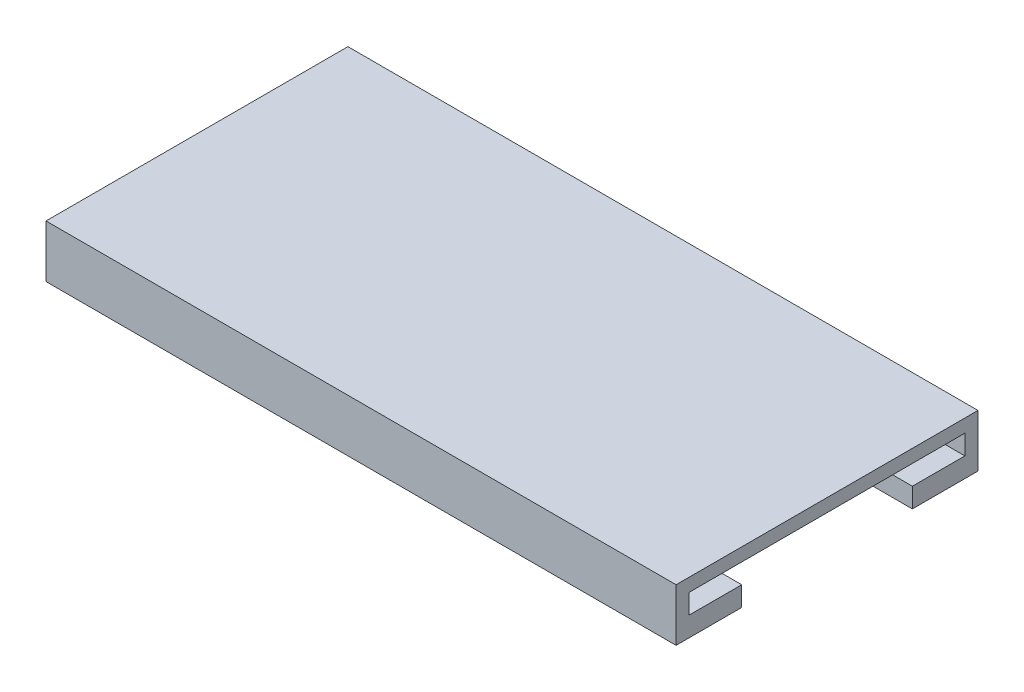
ISO-10303-21;
HEADER;
FILE_DESCRIPTION(('STEP AP214'),'2;1');
FILE_NAME('part.step','',(''),(''),'','','');
FILE_SCHEMA(('AUTOMOTIVE_DESIGN { 1 0 10303 214 1 1 1 1 }'));
ENDSEC;
DATA;
#1=APPLICATION_CONTEXT('core data for automotive mechanical design processes');
#2=APPLICATION_PROTOCOL_DEFINITION('international standard','automotive_design',2000,#1);
#3=PRODUCT_CONTEXT('',#1,'mechanical');
#4=PRODUCT('Part','Part','',(#3));
#5=PRODUCT_RELATED_PRODUCT_CATEGORY('part','',(#4));
#6=PRODUCT_DEFINITION_FORMATION('','',#4);
#7=PRODUCT_DEFINITION_CONTEXT('part definition',#1,'design');
#8=PRODUCT_DEFINITION('design','',#6,#7);
#9=PRODUCT_DEFINITION_SHAPE('','',#8);
#10=(LENGTH_UNIT() NAMED_UNIT(*) SI_UNIT(.MILLI.,.METRE.));
#11=(NAMED_UNIT(*) PLANE_ANGLE_UNIT() SI_UNIT($,.RADIAN.));
#12=(NAMED_UNIT(*) SI_UNIT($,.STERADIAN.) SOLID_ANGLE_UNIT());
#13=UNCERTAINTY_MEASURE_WITH_UNIT(LENGTH_MEASURE(1.E-05),#10,'distance_accuracy_value','');
#14=(GEOMETRIC_REPRESENTATION_CONTEXT(3) GLOBAL_UNCERTAINTY_ASSIGNED_CONTEXT((#13)) GLOBAL_UNIT_ASSIGNED_CONTEXT((#10,
#11,#12)) REPRESENTATION_CONTEXT('',''));
#15=CARTESIAN_POINT('',(0.,0.,0.));
#16=DIRECTION('',(0.,0.,1.));
#17=DIRECTION('',(1.,0.,0.));
#18=AXIS2_PLACEMENT_3D('',#15,#16,#17);
#19=CARTESIAN_POINT('',(76.2,-3.175,-18.25625));
#20=DIRECTION('',(0.,0.,1.));
#21=DIRECTION('',(1.,0.,0.));
#22=AXIS2_PLACEMENT_3D('',#19,#20,#21);
#23=PLANE('',#22);
#24=DIRECTION('',(0.,1.,0.));
#25=VECTOR('',#24,1.);
#26=CARTESIAN_POINT('',(0.,-3.175,-18.25625));
#27=LINE('',#26,#25);
#28=CARTESIAN_POINT('',(0.,-3.175,-18.25625));
#29=VERTEX_POINT('',#28);
#30=CARTESIAN_POINT('',(0.,3.175,-18.25625));
#31=VERTEX_POINT('',#30);
#32=EDGE_CURVE('E170',#29,#31,#27,.T.);
#33=ORIENTED_EDGE('',*,*,#32,.T.);
#34=DIRECTION('',(-1.,0.,0.));
#35=VECTOR('',#34,1.);
#36=CARTESIAN_POINT('',(76.2,3.175,-18.25625));
#37=LINE('',#36,#35);
#38=CARTESIAN_POINT('',(76.2,3.175,-18.25625));
#39=VERTEX_POINT('',#38);
#40=EDGE_CURVE('E11',#39,#31,#37,.T.);
#41=ORIENTED_EDGE('',*,*,#40,.F.);
#42=DIRECTION('',(0.,1.,0.));
#43=VECTOR('',#42,1.);
#44=CARTESIAN_POINT('',(76.2,-3.175,-18.25625));
#45=LINE('',#44,#43);
#46=CARTESIAN_POINT('',(76.2,-3.175,-18.25625));
#47=VERTEX_POINT('',#46);
#48=EDGE_CURVE('E204',#47,#39,#45,.T.);
#49=ORIENTED_EDGE('',*,*,#48,.F.);
#50=DIRECTION('',(-1.,0.,0.));
#51=VECTOR('',#50,1.);
#52=CARTESIAN_POINT('',(76.2,-3.175,-18.25625));
#53=LINE('',#52,#51);
#54=EDGE_CURVE('E166',#47,#29,#53,.T.);
#55=ORIENTED_EDGE('',*,*,#54,.T.);
#56=EDGE_LOOP('',(#33,#41,#49,#55));
#57=FACE_BOUND('',#56,.T.);
#58=ADVANCED_FACE('F45',(#57),#23,.F.);
#59=CARTESIAN_POINT('',(76.2,3.175,18.25625));
#60=DIRECTION('',(0.,-1.,0.));
#61=DIRECTION('',(0.,0.,-1.));
#62=AXIS2_PLACEMENT_3D('',#59,#60,#61);
#63=PLANE('',#62);
#64=DIRECTION('',(0.,0.,1.));
#65=VECTOR('',#64,1.);
#66=CARTESIAN_POINT('',(0.,3.175,18.25625));
#67=LINE('',#66,#65);
#68=CARTESIAN_POINT('',(0.,3.175,18.25625));
#69=VERTEX_POINT('',#68);
#70=EDGE_CURVE('E174',#31,#69,#67,.T.);
#71=ORIENTED_EDGE('',*,*,#70,.T.);
#72=DIRECTION('',(-1.,0.,0.));
#73=VECTOR('',#72,1.);
#74=CARTESIAN_POINT('',(76.2,3.175,18.25625));
#75=LINE('',#74,#73);
#76=CARTESIAN_POINT('',(76.2,3.175,18.25625));
#77=VERTEX_POINT('',#76);
#78=EDGE_CURVE('E54',#77,#69,#75,.T.);
#79=ORIENTED_EDGE('',*,*,#78,.F.);
#80=DIRECTION('',(0.,0.,1.));
#81=VECTOR('',#80,1.);
#82=CARTESIAN_POINT('',(76.2,3.175,18.25625));
#83=LINE('',#82,#81);
#84=EDGE_CURVE('E117',#39,#77,#83,.T.);
#85=ORIENTED_EDGE('',*,*,#84,.F.);
#86=ORIENTED_EDGE('',*,*,#40,.T.);
#87=EDGE_LOOP('',(#71,#79,#85,#86));
#88=FACE_BOUND('',#87,.T.);
#89=ADVANCED_FACE('F298',(#88),#63,.F.);
#90=CARTESIAN_POINT('',(76.2,-3.175,18.25625));
#91=DIRECTION('',(0.,0.,-1.));
#92=DIRECTION('',(-1.,0.,0.));
#93=AXIS2_PLACEMENT_3D('',#90,#91,#92);
#94=PLANE('',#93);
#95=DIRECTION('',(0.,-1.,0.));
#96=VECTOR('',#95,1.);
#97=CARTESIAN_POINT('',(0.,-3.175,18.25625));
#98=LINE('',#97,#96);
#99=CARTESIAN_POINT('',(0.,-3.175,18.25625));
#100=VERTEX_POINT('',#99);
#101=EDGE_CURVE('E177',#69,#100,#98,.T.);
#102=ORIENTED_EDGE('',*,*,#101,.T.);
#103=DIRECTION('',(-1.,0.,0.));
#104=VECTOR('',#103,1.);
#105=CARTESIAN_POINT('',(76.2,-3.175,18.25625));
#106=LINE('',#105,#104);
#107=CARTESIAN_POINT('',(76.2,-3.175,18.25625));
#108=VERTEX_POINT('',#107);
#109=EDGE_CURVE('E231',#108,#100,#106,.T.);
#110=ORIENTED_EDGE('',*,*,#109,.F.);
#111=DIRECTION('',(0.,-1.,0.));
#112=VECTOR('',#111,1.);
#113=CARTESIAN_POINT('',(76.2,-3.175,18.25625));
#114=LINE('',#113,#112);
#115=EDGE_CURVE('E241',#77,#108,#114,.T.);
#116=ORIENTED_EDGE('',*,*,#115,.F.);
#117=ORIENTED_EDGE('',*,*,#78,.T.);
#118=EDGE_LOOP('',(#102,#110,#116,#117));
#119=FACE_BOUND('',#118,.T.);
#120=ADVANCED_FACE('F239',(#119),#94,.F.);
#121=CARTESIAN_POINT('',(76.2,-3.175,18.25625));
#122=DIRECTION('',(0.,1.,0.));
#123=DIRECTION('',(0.,0.,1.));
#124=AXIS2_PLACEMENT_3D('',#121,#122,#123);
#125=PLANE('',#124);
#126=DIRECTION('',(0.,0.,-1.));
#127=VECTOR('',#126,1.);
#128=CARTESIAN_POINT('',(0.,-3.175,18.25625));
#129=LINE('',#128,#127);
#130=CARTESIAN_POINT('',(0.,-3.175,10.31875));
#131=VERTEX_POINT('',#130);
#132=EDGE_CURVE('E180',#100,#131,#129,.T.);
#133=ORIENTED_EDGE('',*,*,#132,.T.);
#134=DIRECTION('',(-1.,0.,0.));
#135=VECTOR('',#134,1.);
#136=CARTESIAN_POINT('',(76.2,-3.175,10.31875));
#137=LINE('',#136,#135);
#138=CARTESIAN_POINT('',(76.2,-3.175,10.31875));
#139=VERTEX_POINT('',#138);
#140=EDGE_CURVE('E227',#139,#131,#137,.T.);
#141=ORIENTED_EDGE('',*,*,#140,.F.);
#142=DIRECTION('',(0.,0.,-1.));
#143=VECTOR('',#142,1.);
#144=CARTESIAN_POINT('',(76.2,-3.175,18.25625));
#145=LINE('',#144,#143);
#146=EDGE_CURVE('E260',#108,#139,#145,.T.);
#147=ORIENTED_EDGE('',*,*,#146,.F.);
#148=ORIENTED_EDGE('',*,*,#109,.T.);
#149=EDGE_LOOP('',(#133,#141,#147,#148));
#150=FACE_BOUND('',#149,.T.);
#151=ADVANCED_FACE('F250',(#150),#125,.F.);
#152=CARTESIAN_POINT('',(76.2,-3.175,10.31875));
#153=DIRECTION('',(0.,0.,1.));
#154=DIRECTION('',(1.,0.,0.));
#155=AXIS2_PLACEMENT_3D('',#152,#153,#154);
#156=PLANE('',#155);
#157=DIRECTION('',(0.,1.,0.));
#158=VECTOR('',#157,1.);
#159=CARTESIAN_POINT('',(0.,-3.175,10.31875));
#160=LINE('',#159,#158);
#161=CARTESIAN_POINT('',(0.,-0.79375,10.31875));
#162=VERTEX_POINT('',#161);
#163=EDGE_CURVE('E183',#131,#162,#160,.T.);
#164=ORIENTED_EDGE('',*,*,#163,.T.);
#165=DIRECTION('',(-1.,0.,0.));
#166=VECTOR('',#165,1.);
#167=CARTESIAN_POINT('',(76.2,-0.79375,10.31875));
#168=LINE('',#167,#166);
#169=CARTESIAN_POINT('',(76.2,-0.79375,10.31875));
#170=VERTEX_POINT('',#169);
#171=EDGE_CURVE('E223',#170,#162,#168,.T.);
#172=ORIENTED_EDGE('',*,*,#171,.F.);
#173=DIRECTION('',(0.,1.,0.));
#174=VECTOR('',#173,1.);
#175=CARTESIAN_POINT('',(76.2,-3.175,10.31875));
#176=LINE('',#175,#174);
#177=EDGE_CURVE('E256',#139,#170,#176,.T.);
#178=ORIENTED_EDGE('',*,*,#177,.F.);
#179=ORIENTED_EDGE('',*,*,#140,.T.);
#180=EDGE_LOOP('',(#164,#172,#178,#179));
#181=FACE_BOUND('',#180,.T.);
#182=ADVANCED_FACE('F254',(#181),#156,.F.);
#183=CARTESIAN_POINT('',(76.2,-0.79375,10.31875));
#184=DIRECTION('',(0.,-1.,0.));
#185=DIRECTION('',(0.,0.,-1.));
#186=AXIS2_PLACEMENT_3D('',#183,#184,#185);
#187=PLANE('',#186);
#188=DIRECTION('',(0.,0.,1.));
#189=VECTOR('',#188,1.);
#190=CARTESIAN_POINT('',(0.,-0.79375,10.31875));
#191=LINE('',#190,#189);
#192=CARTESIAN_POINT('',(0.,-0.793750000000001,16.66875));
#193=VERTEX_POINT('',#192);
#194=EDGE_CURVE('E186',#162,#193,#191,.T.);
#195=ORIENTED_EDGE('',*,*,#194,.T.);
#196=DIRECTION('',(-1.,0.,0.));
#197=VECTOR('',#196,1.);
#198=CARTESIAN_POINT('',(76.2,-0.793750000000001,16.66875));
#199=LINE('',#198,#197);
#200=CARTESIAN_POINT('',(76.2,-0.793750000000001,16.66875));
#201=VERTEX_POINT('',#200);
#202=EDGE_CURVE('E219',#201,#193,#199,.T.);
#203=ORIENTED_EDGE('',*,*,#202,.F.);
#204=DIRECTION('',(0.,0.,1.));
#205=VECTOR('',#204,1.);
#206=CARTESIAN_POINT('',(76.2,-0.79375,10.31875));
#207=LINE('',#206,#205);
#208=EDGE_CURVE('E259',#170,#201,#207,.T.);
#209=ORIENTED_EDGE('',*,*,#208,.F.);
#210=ORIENTED_EDGE('',*,*,#171,.T.);
#211=EDGE_LOOP('',(#195,#203,#209,#210));
#212=FACE_BOUND('',#211,.T.);
#213=ADVANCED_FACE('F311',(#212),#187,.F.);
#214=CARTESIAN_POINT('',(76.2,-0.793750000000001,16.66875));
#215=DIRECTION('',(0.,0.,1.));
#216=DIRECTION('',(1.,0.,0.));
#217=AXIS2_PLACEMENT_3D('',#214,#215,#216);
#218=PLANE('',#217);
#219=DIRECTION('',(0.,1.,0.));
#220=VECTOR('',#219,1.);
#221=CARTESIAN_POINT('',(0.,-0.793750000000001,16.66875));
#222=LINE('',#221,#220);
#223=CARTESIAN_POINT('',(0.,1.5875,16.66875));
#224=VERTEX_POINT('',#223);
#225=EDGE_CURVE('E189',#193,#224,#222,.T.);
#226=ORIENTED_EDGE('',*,*,#225,.T.);
#227=DIRECTION('',(-1.,0.,0.));
#228=VECTOR('',#227,1.);
#229=CARTESIAN_POINT('',(76.2,1.5875,16.66875));
#230=LINE('',#229,#228);
#231=CARTESIAN_POINT('',(76.2,1.5875,16.66875));
#232=VERTEX_POINT('',#231);
#233=EDGE_CURVE('E215',#232,#224,#230,.T.);
#234=ORIENTED_EDGE('',*,*,#233,.F.);
#235=DIRECTION('',(0.,1.,0.));
#236=VECTOR('',#235,1.);
#237=CARTESIAN_POINT('',(76.2,-0.793750000000001,16.66875));
#238=LINE('',#237,#236);
#239=EDGE_CURVE('E264',#201,#232,#238,.T.);
#240=ORIENTED_EDGE('',*,*,#239,.F.);
#241=ORIENTED_EDGE('',*,*,#202,.T.);
#242=EDGE_LOOP('',(#226,#234,#240,#241));
#243=FACE_BOUND('',#242,.T.);
#244=ADVANCED_FACE('F314',(#243),#218,.F.);
#245=CARTESIAN_POINT('',(76.2,1.5875,-16.66875));
#246=DIRECTION('',(0.,1.,0.));
#247=DIRECTION('',(0.,0.,1.));
#248=AXIS2_PLACEMENT_3D('',#245,#246,#247);
#249=PLANE('',#248);
#250=DIRECTION('',(0.,0.,-1.));
#251=VECTOR('',#250,1.);
#252=CARTESIAN_POINT('',(0.,1.5875,-16.66875));
#253=LINE('',#252,#251);
#254=CARTESIAN_POINT('',(0.,1.5875,-16.66875));
#255=VERTEX_POINT('',#254);
#256=EDGE_CURVE('E192',#224,#255,#253,.T.);
#257=ORIENTED_EDGE('',*,*,#256,.T.);
#258=DIRECTION('',(-1.,0.,0.));
#259=VECTOR('',#258,1.);
#260=CARTESIAN_POINT('',(76.2,1.5875,-16.66875));
#261=LINE('',#260,#259);
#262=CARTESIAN_POINT('',(76.2,1.5875,-16.66875));
#263=VERTEX_POINT('',#262);
#264=EDGE_CURVE('E211',#263,#255,#261,.T.);
#265=ORIENTED_EDGE('',*,*,#264,.F.);
#266=DIRECTION('',(0.,0.,-1.));
#267=VECTOR('',#266,1.);
#268=CARTESIAN_POINT('',(76.2,1.5875,-16.66875));
#269=LINE('',#268,#267);
#270=EDGE_CURVE('E271',#232,#263,#269,.T.);
#271=ORIENTED_EDGE('',*,*,#270,.F.);
#272=ORIENTED_EDGE('',*,*,#233,.T.);
#273=EDGE_LOOP('',(#257,#265,#271,#272));
#274=FACE_BOUND('',#273,.T.);
#275=ADVANCED_FACE('F279',(#274),#249,.F.);
#276=CARTESIAN_POINT('',(76.2,-0.79375,-16.66875));
#277=DIRECTION('',(0.,0.,-1.));
#278=DIRECTION('',(-1.,0.,0.));
#279=AXIS2_PLACEMENT_3D('',#276,#277,#278);
#280=PLANE('',#279);
#281=DIRECTION('',(0.,-1.,0.));
#282=VECTOR('',#281,1.);
#283=CARTESIAN_POINT('',(0.,-0.79375,-16.66875));
#284=LINE('',#283,#282);
#285=CARTESIAN_POINT('',(0.,-0.79375,-16.66875));
#286=VERTEX_POINT('',#285);
#287=EDGE_CURVE('E195',#255,#286,#284,.T.);
#288=ORIENTED_EDGE('',*,*,#287,.T.);
#289=DIRECTION('',(-1.,0.,0.));
#290=VECTOR('',#289,1.);
#291=CARTESIAN_POINT('',(76.2,-0.79375,-16.66875));
#292=LINE('',#291,#290);
#293=CARTESIAN_POINT('',(76.2,-0.79375,-16.66875));
#294=VERTEX_POINT('',#293);
#295=EDGE_CURVE('E159',#294,#286,#292,.T.);
#296=ORIENTED_EDGE('',*,*,#295,.F.);
#297=DIRECTION('',(0.,-1.,0.));
#298=VECTOR('',#297,1.);
#299=CARTESIAN_POINT('',(76.2,-0.79375,-16.66875));
#300=LINE('',#299,#298);
#301=EDGE_CURVE('E148',#263,#294,#300,.T.);
#302=ORIENTED_EDGE('',*,*,#301,.F.);
#303=ORIENTED_EDGE('',*,*,#264,.T.);
#304=EDGE_LOOP('',(#288,#296,#302,#303));
#305=FACE_BOUND('',#304,.T.);
#306=ADVANCED_FACE('F283',(#305),#280,.F.);
#307=CARTESIAN_POINT('',(76.2,-0.79375,-10.31875));
#308=DIRECTION('',(0.,-1.,0.));
#309=DIRECTION('',(0.,0.,-1.));
#310=AXIS2_PLACEMENT_3D('',#307,#308,#309);
#311=PLANE('',#310);
#312=DIRECTION('',(0.,0.,1.));
#313=VECTOR('',#312,1.);
#314=CARTESIAN_POINT('',(0.,-0.79375,-10.31875));
#315=LINE('',#314,#313);
#316=CARTESIAN_POINT('',(0.,-0.79375,-10.31875));
#317=VERTEX_POINT('',#316);
#318=EDGE_CURVE('E157',#286,#317,#315,.T.);
#319=ORIENTED_EDGE('',*,*,#318,.T.);
#320=DIRECTION('',(-1.,0.,0.));
#321=VECTOR('',#320,1.);
#322=CARTESIAN_POINT('',(76.2,-0.79375,-10.31875));
#323=LINE('',#322,#321);
#324=CARTESIAN_POINT('',(76.2,-0.79375,-10.31875));
#325=VERTEX_POINT('',#324);
#326=EDGE_CURVE('E154',#325,#317,#323,.T.);
#327=ORIENTED_EDGE('',*,*,#326,.F.);
#328=DIRECTION('',(0.,0.,1.));
#329=VECTOR('',#328,1.);
#330=CARTESIAN_POINT('',(76.2,-0.79375,-10.31875));
#331=LINE('',#330,#329);
#332=EDGE_CURVE('E142',#294,#325,#331,.T.);
#333=ORIENTED_EDGE('',*,*,#332,.F.);
#334=ORIENTED_EDGE('',*,*,#295,.T.);
#335=EDGE_LOOP('',(#319,#327,#333,#334));
#336=FACE_BOUND('',#335,.T.);
#337=ADVANCED_FACE('F155',(#336),#311,.F.);
#338=CARTESIAN_POINT('',(76.2,-3.175,-10.31875));
#339=DIRECTION('',(0.,0.,-1.));
#340=DIRECTION('',(-1.,0.,0.));
#341=AXIS2_PLACEMENT_3D('',#338,#339,#340);
#342=PLANE('',#341);
#343=DIRECTION('',(0.,-1.,0.));
#344=VECTOR('',#343,1.);
#345=CARTESIAN_POINT('',(0.,-3.175,-10.31875));
#346=LINE('',#345,#344);
#347=CARTESIAN_POINT('',(0.,-3.175,-10.31875));
#348=VERTEX_POINT('',#347);
#349=EDGE_CURVE('E103',#317,#348,#346,.T.);
#350=ORIENTED_EDGE('',*,*,#349,.T.);
#351=DIRECTION('',(-1.,0.,0.));
#352=VECTOR('',#351,1.);
#353=CARTESIAN_POINT('',(76.2,-3.175,-10.31875));
#354=LINE('',#353,#352);
#355=CARTESIAN_POINT('',(76.2,-3.175,-10.31875));
#356=VERTEX_POINT('',#355);
#357=EDGE_CURVE('E160',#356,#348,#354,.T.);
#358=ORIENTED_EDGE('',*,*,#357,.F.);
#359=DIRECTION('',(0.,-1.,0.));
#360=VECTOR('',#359,1.);
#361=CARTESIAN_POINT('',(76.2,-3.175,-10.31875));
#362=LINE('',#361,#360);
#363=EDGE_CURVE('E146',#325,#356,#362,.T.);
#364=ORIENTED_EDGE('',*,*,#363,.F.);
#365=ORIENTED_EDGE('',*,*,#326,.T.);
#366=EDGE_LOOP('',(#350,#358,#364,#365));
#367=FACE_BOUND('',#366,.T.);
#368=ADVANCED_FACE('F162',(#367),#342,.F.);
#369=CARTESIAN_POINT('',(76.2,-3.175,-10.31875));
#370=DIRECTION('',(0.,1.,0.));
#371=DIRECTION('',(0.,0.,1.));
#372=AXIS2_PLACEMENT_3D('',#369,#370,#371);
#373=PLANE('',#372);
#374=DIRECTION('',(0.,0.,-1.));
#375=VECTOR('',#374,1.);
#376=CARTESIAN_POINT('',(0.,-3.175,-10.31875));
#377=LINE('',#376,#375);
#378=EDGE_CURVE('E109',#348,#29,#377,.T.);
#379=ORIENTED_EDGE('',*,*,#378,.T.);
#380=ORIENTED_EDGE('',*,*,#54,.F.);
#381=DIRECTION('',(0.,0.,-1.));
#382=VECTOR('',#381,1.);
#383=CARTESIAN_POINT('',(76.2,-3.175,-10.31875));
#384=LINE('',#383,#382);
#385=EDGE_CURVE('E62',#356,#47,#384,.T.);
#386=ORIENTED_EDGE('',*,*,#385,.F.);
#387=ORIENTED_EDGE('',*,*,#357,.T.);
#388=EDGE_LOOP('',(#379,#380,#386,#387));
#389=FACE_BOUND('',#388,.T.);
#390=ADVANCED_FACE('F287',(#389),#373,.F.);
#391=CARTESIAN_POINT('',(76.2,0.,0.));
#392=DIRECTION('',(-1.,0.,0.));
#393=DIRECTION('',(0.,0.,1.));
#394=AXIS2_PLACEMENT_3D('',#391,#392,#393);
#395=PLANE('',#394);
#396=ORIENTED_EDGE('',*,*,#48,.T.);
#397=ORIENTED_EDGE('',*,*,#84,.T.);
#398=ORIENTED_EDGE('',*,*,#115,.T.);
#399=ORIENTED_EDGE('',*,*,#146,.T.);
#400=ORIENTED_EDGE('',*,*,#177,.T.);
#401=ORIENTED_EDGE('',*,*,#208,.T.);
#402=ORIENTED_EDGE('',*,*,#239,.T.);
#403=ORIENTED_EDGE('',*,*,#270,.T.);
#404=ORIENTED_EDGE('',*,*,#301,.T.);
#405=ORIENTED_EDGE('',*,*,#332,.T.);
#406=ORIENTED_EDGE('',*,*,#363,.T.);
#407=ORIENTED_EDGE('',*,*,#385,.T.);
#408=EDGE_LOOP('',(#396,#397,#398,#399,#400,#401,#402,#403,#404,#405,#406,#407));
#409=FACE_BOUND('',#408,.T.);
#410=ADVANCED_FACE('F144',(#409),#395,.F.);
#411=CARTESIAN_POINT('',(0.,0.,0.));
#412=DIRECTION('',(-1.,0.,0.));
#413=DIRECTION('',(0.,0.,1.));
#414=AXIS2_PLACEMENT_3D('',#411,#412,#413);
#415=PLANE('',#414);
#416=ORIENTED_EDGE('',*,*,#32,.F.);
#417=ORIENTED_EDGE('',*,*,#378,.F.);
#418=ORIENTED_EDGE('',*,*,#349,.F.);
#419=ORIENTED_EDGE('',*,*,#318,.F.);
#420=ORIENTED_EDGE('',*,*,#287,.F.);
#421=ORIENTED_EDGE('',*,*,#256,.F.);
#422=ORIENTED_EDGE('',*,*,#225,.F.);
#423=ORIENTED_EDGE('',*,*,#194,.F.);
#424=ORIENTED_EDGE('',*,*,#163,.F.);
#425=ORIENTED_EDGE('',*,*,#132,.F.);
#426=ORIENTED_EDGE('',*,*,#101,.F.);
#427=ORIENTED_EDGE('',*,*,#70,.F.);
#428=EDGE_LOOP('',(#416,#417,#418,#419,#420,#421,#422,#423,#424,#425,#426,#427));
#429=FACE_BOUND('',#428,.T.);
#430=ADVANCED_FACE('F245',(#429),#415,.T.);
#431=CLOSED_SHELL('',(#58,#89,#120,#151,#182,#213,#244,#275,#306,#337,#368,#390,#410,#430));
#432=MANIFOLD_SOLID_BREP('B2',#431);
#433=ADVANCED_BREP_SHAPE_REPRESENTATION('',(#18,#432),#14);
#434=SHAPE_DEFINITION_REPRESENTATION(#9,#433);
ENDSEC;
END-ISO-10303-21;
